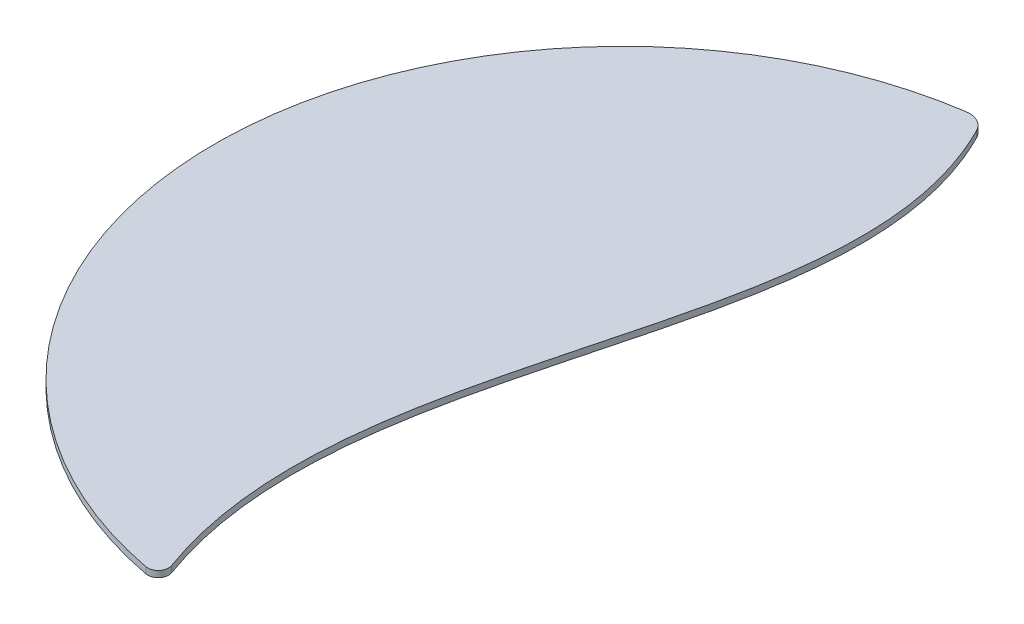
ISO-10303-21;
HEADER;
FILE_DESCRIPTION(('STEP AP214'),'2;1');
FILE_NAME('part.step','',(''),(''),'','','');
FILE_SCHEMA(('AUTOMOTIVE_DESIGN { 1 0 10303 214 1 1 1 1 }'));
ENDSEC;
DATA;
#1=APPLICATION_CONTEXT('core data for automotive mechanical design processes');
#2=APPLICATION_PROTOCOL_DEFINITION('international standard','automotive_design',2000,#1);
#3=PRODUCT_CONTEXT('',#1,'mechanical');
#4=PRODUCT('Part','Part','',(#3));
#5=PRODUCT_RELATED_PRODUCT_CATEGORY('part','',(#4));
#6=PRODUCT_DEFINITION_FORMATION('','',#4);
#7=PRODUCT_DEFINITION_CONTEXT('part definition',#1,'design');
#8=PRODUCT_DEFINITION('design','',#6,#7);
#9=PRODUCT_DEFINITION_SHAPE('','',#8);
#10=(LENGTH_UNIT() NAMED_UNIT(*) SI_UNIT(.MILLI.,.METRE.));
#11=(NAMED_UNIT(*) PLANE_ANGLE_UNIT() SI_UNIT($,.RADIAN.));
#12=(NAMED_UNIT(*) SI_UNIT($,.STERADIAN.) SOLID_ANGLE_UNIT());
#13=UNCERTAINTY_MEASURE_WITH_UNIT(LENGTH_MEASURE(1.E-05),#10,'distance_accuracy_value','');
#14=(GEOMETRIC_REPRESENTATION_CONTEXT(3) GLOBAL_UNCERTAINTY_ASSIGNED_CONTEXT((#13)) GLOBAL_UNIT_ASSIGNED_CONTEXT((#10,
#11,#12)) REPRESENTATION_CONTEXT('',''));
#15=CARTESIAN_POINT('',(0.,0.,0.));
#16=DIRECTION('',(0.,0.,1.));
#17=DIRECTION('',(1.,0.,0.));
#18=AXIS2_PLACEMENT_3D('',#15,#16,#17);
#19=CARTESIAN_POINT('',(-27.6088512063822,3.,193.03562193301));
#20=CARTESIAN_POINT('',(-28.5507311366336,3.,190.768029803146));
#21=CARTESIAN_POINT('',(-30.3566514432876,3.,186.174483348762));
#22=CARTESIAN_POINT('',(-33.5536126873634,3.,177.034814152089));
#23=CARTESIAN_POINT('',(-36.8435813569349,3.,165.585407167431));
#24=CARTESIAN_POINT('',(-39.7166480619711,3.,151.885293025165));
#25=CARTESIAN_POINT('',(-42.2269305043539,3.,133.706350520889));
#26=CARTESIAN_POINT('',(-43.1056184329985,3.,111.227065060671));
#27=CARTESIAN_POINT('',(-41.2843004133004,3.,84.7842629616032));
#28=CARTESIAN_POINT('',(-37.3171367802483,3.,58.898561137862));
#29=CARTESIAN_POINT('',(-31.8850361072146,3.,33.5429964263087));
#30=CARTESIAN_POINT('',(-25.6233626008715,3.,8.68021477113076));
#31=CARTESIAN_POINT('',(-19.1319497055203,3.,-15.7139103491385));
#32=CARTESIAN_POINT('',(-12.9827337525678,3.,-39.6404196508713));
#33=CARTESIAN_POINT('',(-7.72080061441582,3.,-63.0767289719216));
#34=CARTESIAN_POINT('',(-3.85787606019093,3.,-85.9832167889666));
#35=CARTESIAN_POINT('',(-1.86305097458316,3.,-108.324397723477));
#36=CARTESIAN_POINT('',(-2.1036898869433,3.,-126.471919674788));
#37=CARTESIAN_POINT('',(-3.63835028243398,3.,-140.766353813877));
#38=CARTESIAN_POINT('',(-5.51154676016795,3.,-151.398455895264));
#39=CARTESIAN_POINT('',(-8.16591164443996,3.,-161.976754005312));
#40=CARTESIAN_POINT('',(-11.0838415343253,3.,-170.778461005505));
#41=CARTESIAN_POINT('',(-13.8803636568954,3.,-177.832066934414));
#42=CARTESIAN_POINT('',(-16.2186633629391,3.,-183.132088604644));
#43=CARTESIAN_POINT('',(-18.3792484765534,3.,-187.563874928097));
#44=CARTESIAN_POINT('',(-20.2366696845669,3.,-191.113640386204));
#45=CARTESIAN_POINT('',(-21.2159068456043,3.,-192.90194859676));
#46=CARTESIAN_POINT('',(-21.7116789628955,3.,-193.787520229283));
#47=B_SPLINE_CURVE_WITH_KNOTS('',3,(#19,#20,#21,#22,#23,#24,#25,#26,#27,#28,#29,#30,#31,#32,#33,
#34,#35,#36,#37,#38,#39,#40,#41,#42,#43,#44,#45,#46),.UNSPECIFIED.,.F.,.F.,(4,1,1,1,1,1,1,1,1,1,
1,1,1,1,1,1,1,1,1,1,1,1,1,1,1,4),(-0.00695597316322619,0.00815936962069305,0.0232747124046123,
0.0535053979724508,0.0837360835402892,0.113966769108128,0.174428140243805,0.234889511379482,
0.295350882515158,0.355812253650835,0.416273624786512,0.476734995922189,0.537196367057866,
0.597657738193543,0.65811910932922,0.718580480464897,0.779041851600574,0.809272537168412,
0.839503222736251,0.869733908304089,0.899964593871928,0.915079936655847,0.930195279439766,
0.945310622223685,0.952868293615645,0.960425965007605),.UNSPECIFIED.);
#48=DIRECTION('',(0.,-1.,0.));
#49=VECTOR('',#48,1.);
#50=SURFACE_OF_LINEAR_EXTRUSION('',#47,#49);
#51=CARTESIAN_POINT('',(-27.6088512063822,0.,193.03562193301));
#52=CARTESIAN_POINT('',(-28.5507311366336,0.,190.768029803146));
#53=CARTESIAN_POINT('',(-30.3566514432876,0.,186.174483348762));
#54=CARTESIAN_POINT('',(-33.5536126873634,0.,177.034814152089));
#55=CARTESIAN_POINT('',(-36.8435813569349,0.,165.585407167431));
#56=CARTESIAN_POINT('',(-39.7166480619711,0.,151.885293025165));
#57=CARTESIAN_POINT('',(-42.2269305043539,0.,133.706350520889));
#58=CARTESIAN_POINT('',(-43.1056184329985,0.,111.227065060671));
#59=CARTESIAN_POINT('',(-41.2843004133004,0.,84.7842629616032));
#60=CARTESIAN_POINT('',(-37.3171367802483,0.,58.898561137862));
#61=CARTESIAN_POINT('',(-31.8850361072146,0.,33.5429964263087));
#62=CARTESIAN_POINT('',(-25.6233626008715,0.,8.68021477113076));
#63=CARTESIAN_POINT('',(-19.1319497055203,0.,-15.7139103491385));
#64=CARTESIAN_POINT('',(-12.9827337525678,0.,-39.6404196508713));
#65=CARTESIAN_POINT('',(-7.72080061441582,0.,-63.0767289719216));
#66=CARTESIAN_POINT('',(-3.85787606019093,0.,-85.9832167889666));
#67=CARTESIAN_POINT('',(-1.86305097458316,0.,-108.324397723477));
#68=CARTESIAN_POINT('',(-2.1036898869433,0.,-126.471919674788));
#69=CARTESIAN_POINT('',(-3.63835028243398,0.,-140.766353813877));
#70=CARTESIAN_POINT('',(-5.51154676016795,0.,-151.398455895264));
#71=CARTESIAN_POINT('',(-8.16591164443996,0.,-161.976754005312));
#72=CARTESIAN_POINT('',(-11.0838415343253,0.,-170.778461005505));
#73=CARTESIAN_POINT('',(-13.8803636568954,0.,-177.832066934414));
#74=CARTESIAN_POINT('',(-16.2186633629391,0.,-183.132088604644));
#75=CARTESIAN_POINT('',(-18.3792484765534,0.,-187.563874928097));
#76=CARTESIAN_POINT('',(-20.2366696845669,0.,-191.113640386204));
#77=CARTESIAN_POINT('',(-21.2159068456043,0.,-192.90194859676));
#78=CARTESIAN_POINT('',(-21.7116789628955,0.,-193.787520229283));
#79=B_SPLINE_CURVE_WITH_KNOTS('',3,(#51,#52,#53,#54,#55,#56,#57,#58,#59,#60,#61,#62,#63,#64,#65,
#66,#67,#68,#69,#70,#71,#72,#73,#74,#75,#76,#77,#78),.UNSPECIFIED.,.F.,.F.,(4,1,1,1,1,1,1,1,1,1,
1,1,1,1,1,1,1,1,1,1,1,1,1,1,1,4),(-0.00695597316322619,0.00815936962069305,0.0232747124046123,
0.0535053979724508,0.0837360835402892,0.113966769108128,0.174428140243805,0.234889511379482,
0.295350882515158,0.355812253650835,0.416273624786512,0.476734995922189,0.537196367057866,
0.597657738193543,0.65811910932922,0.718580480464897,0.779041851600574,0.809272537168412,
0.839503222736251,0.869733908304089,0.899964593871928,0.915079936655847,0.930195279439766,
0.945310622223685,0.952868293615645,0.960425965007605),.UNSPECIFIED.);
#80=CARTESIAN_POINT('',(-30.7559422656813,0.,184.953317156399));
#81=VERTEX_POINT('',#80);
#82=CARTESIAN_POINT('',(-18.3549229551799,0.,-187.46651977956));
#83=VERTEX_POINT('',#82);
#84=EDGE_CURVE('E97',#81,#83,#79,.T.);
#85=ORIENTED_EDGE('',*,*,#84,.T.);
#86=DIRECTION('',(0.,-1.,0.));
#87=VECTOR('',#86,1.);
#88=CARTESIAN_POINT('',(-18.3549229551744,0.,-187.466519779549));
#89=LINE('',#88,#87);
#90=CARTESIAN_POINT('',(-18.3549229551799,3.,-187.46651977956));
#91=VERTEX_POINT('',#90);
#92=EDGE_CURVE('E50',#83,#91,#89,.F.);
#93=ORIENTED_EDGE('',*,*,#92,.T.);
#94=CARTESIAN_POINT('',(-30.7559422656829,3.,184.953317156395));
#95=VERTEX_POINT('',#94);
#96=EDGE_CURVE('E96',#95,#91,#47,.T.);
#97=ORIENTED_EDGE('',*,*,#96,.F.);
#98=DIRECTION('',(0.,-1.,0.));
#99=VECTOR('',#98,1.);
#100=CARTESIAN_POINT('',(-30.7559422656829,3.,184.953317156395));
#101=LINE('',#100,#99);
#102=EDGE_CURVE('E83',#95,#81,#101,.T.);
#103=ORIENTED_EDGE('',*,*,#102,.T.);
#104=EDGE_LOOP('',(#85,#93,#97,#103));
#105=FACE_BOUND('',#104,.T.);
#106=ADVANCED_FACE('F35',(#105),#50,.F.);
#107=CARTESIAN_POINT('',(-2.78874145998032E-11,3.,-3.55810758460862E-12));
#108=DIRECTION('',(0.,-1.,0.));
#109=DIRECTION('',(0.,0.,-1.));
#110=AXIS2_PLACEMENT_3D('',#107,#108,#109);
#111=CYLINDRICAL_SURFACE('',#110,195.);
#112=CARTESIAN_POINT('',(-2.78874145998032E-11,3.,-3.55810758460862E-12));
#113=DIRECTION('',(0.,1.,0.));
#114=DIRECTION('',(0.,0.,1.));
#115=AXIS2_PLACEMENT_3D('',#112,#113,#114);
#116=CIRCLE('',#115,195.);
#117=CARTESIAN_POINT('',(-28.7651678039579,3.,-192.866702987356));
#118=VERTEX_POINT('',#117);
#119=CARTESIAN_POINT('',(-36.3876808617704,3.,191.574885309903));
#120=VERTEX_POINT('',#119);
#121=EDGE_CURVE('E92',#118,#120,#116,.T.);
#122=ORIENTED_EDGE('',*,*,#121,.F.);
#123=DIRECTION('',(0.,-1.,0.));
#124=VECTOR('',#123,1.);
#125=CARTESIAN_POINT('',(-28.7651678039579,3.,-192.866702987356));
#126=LINE('',#125,#124);
#127=CARTESIAN_POINT('',(-28.7651678039579,0.,-192.866702987356));
#128=VERTEX_POINT('',#127);
#129=EDGE_CURVE('E79',#118,#128,#126,.T.);
#130=ORIENTED_EDGE('',*,*,#129,.T.);
#131=CARTESIAN_POINT('',(-2.78874145998032E-11,0.,-3.55810758460862E-12));
#132=DIRECTION('',(0.,1.,0.));
#133=DIRECTION('',(0.,0.,1.));
#134=AXIS2_PLACEMENT_3D('',#131,#132,#133);
#135=CIRCLE('',#134,195.);
#136=CARTESIAN_POINT('',(-36.3876808617704,0.,191.574885309903));
#137=VERTEX_POINT('',#136);
#138=EDGE_CURVE('E90',#128,#137,#135,.T.);
#139=ORIENTED_EDGE('',*,*,#138,.T.);
#140=DIRECTION('',(0.,-1.,0.));
#141=VECTOR('',#140,1.);
#142=CARTESIAN_POINT('',(-36.3876808617704,3.,191.574885309903));
#143=LINE('',#142,#141);
#144=EDGE_CURVE('E93',#137,#120,#143,.F.);
#145=ORIENTED_EDGE('',*,*,#144,.T.);
#146=EDGE_LOOP('',(#122,#130,#139,#145));
#147=FACE_BOUND('',#146,.T.);
#148=ADVANCED_FACE('F89',(#147),#111,.T.);
#149=CARTESIAN_POINT('',(-19.1889825292534,3.,-15.6359743793824));
#150=DIRECTION('',(0.,1.,0.));
#151=DIRECTION('',(0.,0.,1.));
#152=AXIS2_PLACEMENT_3D('',#149,#150,#151);
#153=PLANE('',#152);
#154=ORIENTED_EDGE('',*,*,#96,.T.);
#155=CARTESIAN_POINT('',(-27.2900309935,3.,-182.976102834159));
#156=DIRECTION('',(0.,1.,0.));
#157=DIRECTION('',(0.,0.,1.));
#158=AXIS2_PLACEMENT_3D('',#155,#156,#157);
#159=CIRCLE('',#158,10.);
#160=EDGE_CURVE('E12',#91,#118,#159,.T.);
#161=ORIENTED_EDGE('',*,*,#160,.T.);
#162=ORIENTED_EDGE('',*,*,#121,.T.);
#163=CARTESIAN_POINT('',(-35.454663403777,3.,186.662708763496));
#164=DIRECTION('',(0.,1.,0.));
#165=DIRECTION('',(0.,0.,1.));
#166=AXIS2_PLACEMENT_3D('',#163,#164,#165);
#167=CIRCLE('',#166,5.);
#168=EDGE_CURVE('E43',#120,#95,#167,.T.);
#169=ORIENTED_EDGE('',*,*,#168,.T.);
#170=EDGE_LOOP('',(#154,#161,#162,#169));
#171=FACE_BOUND('',#170,.T.);
#172=ADVANCED_FACE('F111',(#171),#153,.T.);
#173=CARTESIAN_POINT('',(-19.1889825292534,0.,-15.6359743793824));
#174=DIRECTION('',(0.,1.,0.));
#175=DIRECTION('',(0.,0.,1.));
#176=AXIS2_PLACEMENT_3D('',#173,#174,#175);
#177=PLANE('',#176);
#178=ORIENTED_EDGE('',*,*,#138,.F.);
#179=CARTESIAN_POINT('',(-27.2900309935,0.,-182.976102834159));
#180=DIRECTION('',(0.,1.,0.));
#181=DIRECTION('',(0.,0.,1.));
#182=AXIS2_PLACEMENT_3D('',#179,#180,#181);
#183=CIRCLE('',#182,10.);
#184=EDGE_CURVE('E75',#128,#83,#183,.F.);
#185=ORIENTED_EDGE('',*,*,#184,.T.);
#186=ORIENTED_EDGE('',*,*,#84,.F.);
#187=CARTESIAN_POINT('',(-35.454663403777,0.,186.662708763496));
#188=DIRECTION('',(0.,1.,0.));
#189=DIRECTION('',(0.,0.,1.));
#190=AXIS2_PLACEMENT_3D('',#187,#188,#189);
#191=CIRCLE('',#190,5.);
#192=EDGE_CURVE('E84',#81,#137,#191,.F.);
#193=ORIENTED_EDGE('',*,*,#192,.T.);
#194=EDGE_LOOP('',(#178,#185,#186,#193));
#195=FACE_BOUND('',#194,.T.);
#196=ADVANCED_FACE('F95',(#195),#177,.F.);
#197=CARTESIAN_POINT('',(-27.2900309935,1.5,-182.976102834159));
#198=DIRECTION('',(0.,-1.,0.));
#199=DIRECTION('',(0.,0.,-1.));
#200=AXIS2_PLACEMENT_3D('',#197,#198,#199);
#201=CYLINDRICAL_SURFACE('',#200,10.);
#202=ORIENTED_EDGE('',*,*,#160,.F.);
#203=ORIENTED_EDGE('',*,*,#92,.F.);
#204=ORIENTED_EDGE('',*,*,#184,.F.);
#205=ORIENTED_EDGE('',*,*,#129,.F.);
#206=EDGE_LOOP('',(#202,#203,#204,#205));
#207=FACE_BOUND('',#206,.T.);
#208=ADVANCED_FACE('F78',(#207),#201,.T.);
#209=CARTESIAN_POINT('',(-35.454663403777,1.5,186.662708763496));
#210=DIRECTION('',(0.,-1.,0.));
#211=DIRECTION('',(0.,0.,-1.));
#212=AXIS2_PLACEMENT_3D('',#209,#210,#211);
#213=CYLINDRICAL_SURFACE('',#212,5.);
#214=ORIENTED_EDGE('',*,*,#168,.F.);
#215=ORIENTED_EDGE('',*,*,#144,.F.);
#216=ORIENTED_EDGE('',*,*,#192,.F.);
#217=ORIENTED_EDGE('',*,*,#102,.F.);
#218=EDGE_LOOP('',(#214,#215,#216,#217));
#219=FACE_BOUND('',#218,.T.);
#220=ADVANCED_FACE('F37',(#219),#213,.T.);
#221=CLOSED_SHELL('',(#106,#148,#172,#196,#208,#220));
#222=MANIFOLD_SOLID_BREP('B2',#221);
#223=ADVANCED_BREP_SHAPE_REPRESENTATION('',(#18,#222),#14);
#224=SHAPE_DEFINITION_REPRESENTATION(#9,#223);
ENDSEC;
END-ISO-10303-21;
